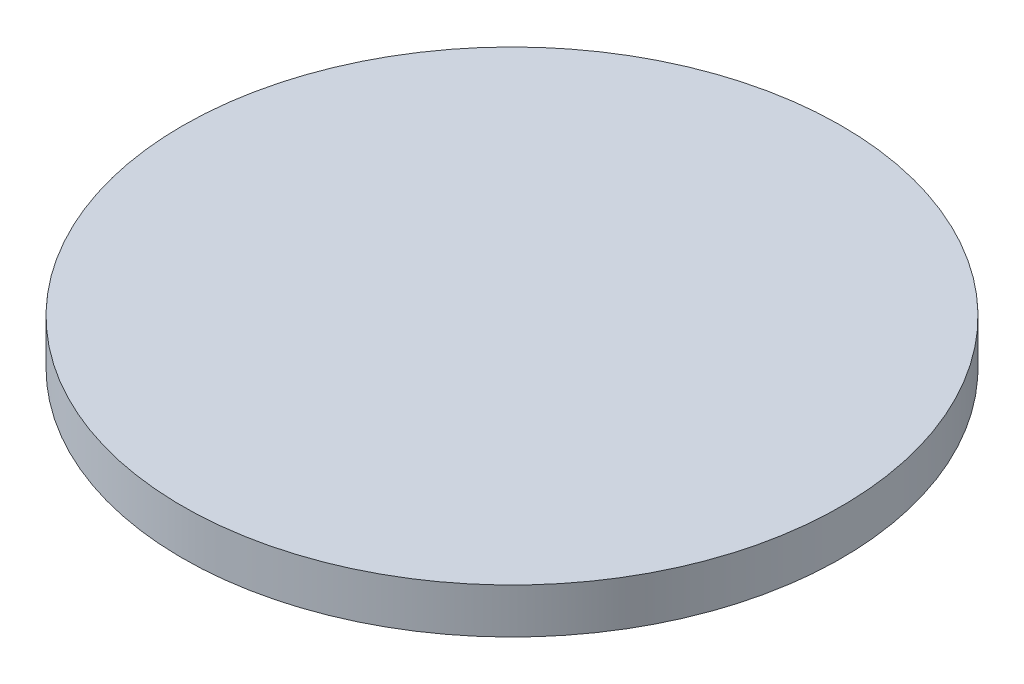
ISO-10303-21;
HEADER;
FILE_DESCRIPTION(('STEP AP214'),'2;1');
FILE_NAME('part.step','',(''),(''),'','','');
FILE_SCHEMA(('AUTOMOTIVE_DESIGN { 1 0 10303 214 1 1 1 1 }'));
ENDSEC;
DATA;
#1=APPLICATION_CONTEXT('core data for automotive mechanical design processes');
#2=APPLICATION_PROTOCOL_DEFINITION('international standard','automotive_design',2000,#1);
#3=PRODUCT_CONTEXT('',#1,'mechanical');
#4=PRODUCT('Part','Part','',(#3));
#5=PRODUCT_RELATED_PRODUCT_CATEGORY('part','',(#4));
#6=PRODUCT_DEFINITION_FORMATION('','',#4);
#7=PRODUCT_DEFINITION_CONTEXT('part definition',#1,'design');
#8=PRODUCT_DEFINITION('design','',#6,#7);
#9=PRODUCT_DEFINITION_SHAPE('','',#8);
#10=(LENGTH_UNIT() NAMED_UNIT(*) SI_UNIT(.MILLI.,.METRE.));
#11=(NAMED_UNIT(*) PLANE_ANGLE_UNIT() SI_UNIT($,.RADIAN.));
#12=(NAMED_UNIT(*) SI_UNIT($,.STERADIAN.) SOLID_ANGLE_UNIT());
#13=UNCERTAINTY_MEASURE_WITH_UNIT(LENGTH_MEASURE(1.E-05),#10,'distance_accuracy_value','');
#14=(GEOMETRIC_REPRESENTATION_CONTEXT(3) GLOBAL_UNCERTAINTY_ASSIGNED_CONTEXT((#13)) GLOBAL_UNIT_ASSIGNED_CONTEXT((#10,
#11,#12)) REPRESENTATION_CONTEXT('',''));
#15=CARTESIAN_POINT('',(0.,0.,0.));
#16=DIRECTION('',(0.,0.,1.));
#17=DIRECTION('',(1.,0.,0.));
#18=AXIS2_PLACEMENT_3D('',#15,#16,#17);
#19=CARTESIAN_POINT('',(-127.302025827772,-45.9930835907232,-0.000163139255021216));
#20=CARTESIAN_POINT('',(-127.302025827772,-45.9930835907232,-2.65855316857933));
#21=CARTESIAN_POINT('',(-127.040829172573,-45.9930835907232,-7.97533322722799));
#22=CARTESIAN_POINT('',(-125.869217424041,-45.9930835907232,-15.8736980675823));
#23=CARTESIAN_POINT('',(-123.929072171381,-45.9930835907232,-23.61919208922));
#24=CARTESIAN_POINT('',(-121.239078073968,-45.9930835907232,-31.1372219505949));
#25=CARTESIAN_POINT('',(-117.825141245459,-45.9930835907232,-38.3553849143689));
#26=CARTESIAN_POINT('',(-113.720139763762,-45.9930835907232,-45.2041661253515));
#27=CARTESIAN_POINT('',(-108.963607037167,-45.9930835907232,-51.6176080765563));
#28=CARTESIAN_POINT('',(-103.601351076016,-45.9930835907232,-57.5339458160494));
#29=CARTESIAN_POINT('',(-97.6850133365234,-45.9930835907232,-62.8962017771999));
#30=CARTESIAN_POINT('',(-91.2715713853185,-45.9930835907232,-67.652734503795));
#31=CARTESIAN_POINT('',(-84.4227901743359,-45.9930835907232,-71.7577359854921));
#32=CARTESIAN_POINT('',(-77.2046272105619,-45.9930835907232,-75.1716728140005));
#33=CARTESIAN_POINT('',(-69.686597349187,-45.9930835907232,-77.8616669114139));
#34=CARTESIAN_POINT('',(-61.9411033275493,-45.9930835907232,-79.8018121640739));
#35=CARTESIAN_POINT('',(-54.042738487195,-45.9930835907232,-80.973423912606));
#36=CARTESIAN_POINT('',(-46.067568399222,-45.9930835907232,-81.3652188954038));
#37=CARTESIAN_POINT('',(-38.092398311249,-45.9930835907232,-80.973423912606));
#38=CARTESIAN_POINT('',(-30.1940334708947,-45.9930835907232,-79.8018121640739));
#39=CARTESIAN_POINT('',(-22.448539449257,-45.9930835907232,-77.8616669114139));
#40=CARTESIAN_POINT('',(-14.9305095878821,-45.9930835907232,-75.1716728140005));
#41=CARTESIAN_POINT('',(-7.71234662410811,-45.9930835907232,-71.7577359854922));
#42=CARTESIAN_POINT('',(-0.863565413125529,-45.9930835907232,-67.652734503795));
#43=CARTESIAN_POINT('',(5.54987653807935,-45.9930835907232,-62.8962017771999));
#44=CARTESIAN_POINT('',(11.4662142775723,-45.9930835907232,-57.5339458160494));
#45=CARTESIAN_POINT('',(16.8284702387229,-45.9930835907232,-51.6176080765564));
#46=CARTESIAN_POINT('',(21.585002965318,-45.9930835907232,-45.2041661253515));
#47=CARTESIAN_POINT('',(25.6900044470151,-45.9930835907232,-38.3553849143689));
#48=CARTESIAN_POINT('',(29.1039412755235,-45.9930835907232,-31.1372219505949));
#49=CARTESIAN_POINT('',(31.7939353729369,-45.9930835907232,-23.61919208922));
#50=CARTESIAN_POINT('',(33.7340806255969,-45.9930835907232,-15.8736980675823));
#51=CARTESIAN_POINT('',(34.905692374129,-45.9930835907232,-7.975333227228));
#52=CARTESIAN_POINT('',(35.2974873569268,-45.9930835907232,-0.000163139254994738));
#53=CARTESIAN_POINT('',(34.905692374129,-45.9930835907232,7.97500694871788));
#54=CARTESIAN_POINT('',(33.7340806255969,-45.9930835907233,15.8733717890723));
#55=CARTESIAN_POINT('',(31.7939353729369,-45.9930835907232,23.6188658107099));
#56=CARTESIAN_POINT('',(29.1039412755235,-45.9930835907232,31.1368956720849));
#57=CARTESIAN_POINT('',(25.6900044470152,-45.9930835907232,38.3550586358588));
#58=CARTESIAN_POINT('',(21.585002965318,-45.9930835907232,45.2038398468415));
#59=CARTESIAN_POINT('',(16.828470238723,-45.9930835907233,51.6172817980463));
#60=CARTESIAN_POINT('',(11.4662142775723,-45.9930835907232,57.5336195375393));
#61=CARTESIAN_POINT('',(5.54987653807935,-45.9930835907232,62.8958754986899));
#62=CARTESIAN_POINT('',(-0.863565413125542,-45.9930835907232,67.652408225285));
#63=CARTESIAN_POINT('',(-7.71234662410805,-45.9930835907232,71.757409706982));
#64=CARTESIAN_POINT('',(-14.9305095878821,-45.9930835907232,75.1713465354905));
#65=CARTESIAN_POINT('',(-22.4485394492569,-45.9930835907232,77.8613406329038));
#66=CARTESIAN_POINT('',(-30.1940334708947,-45.9930835907232,79.8014858855638));
#67=CARTESIAN_POINT('',(-38.092398311249,-45.9930835907232,80.9730976340959));
#68=CARTESIAN_POINT('',(-46.0675683992219,-45.9930835907232,81.3648926168938));
#69=CARTESIAN_POINT('',(-54.042738487195,-45.9930835907232,80.9730976340959));
#70=CARTESIAN_POINT('',(-61.9411033275493,-45.9930835907233,79.8014858855639));
#71=CARTESIAN_POINT('',(-69.686597349187,-45.9930835907232,77.8613406329038));
#72=CARTESIAN_POINT('',(-77.2046272105619,-45.9930835907232,75.1713465354905));
#73=CARTESIAN_POINT('',(-84.4227901743359,-45.9930835907232,71.7574097069821));
#74=CARTESIAN_POINT('',(-91.2715713853184,-45.9930835907232,67.652408225285));
#75=CARTESIAN_POINT('',(-97.6850133365233,-45.9930835907232,62.8958754986899));
#76=CARTESIAN_POINT('',(-103.601351076016,-45.9930835907233,57.5336195375394));
#77=CARTESIAN_POINT('',(-108.963607037167,-45.9930835907232,51.6172817980463));
#78=CARTESIAN_POINT('',(-113.720139763762,-45.9930835907232,45.2038398468415));
#79=CARTESIAN_POINT('',(-117.825141245459,-45.9930835907232,38.3550586358588));
#80=CARTESIAN_POINT('',(-121.239078073967,-45.9930835907232,31.136895672085));
#81=CARTESIAN_POINT('',(-123.929072171381,-45.9930835907232,23.61886581071));
#82=CARTESIAN_POINT('',(-125.869217424041,-45.9930835907232,15.8733717890723));
#83=CARTESIAN_POINT('',(-127.040829172573,-45.9930835907232,7.97500694871791));
#84=CARTESIAN_POINT('',(-127.302025827772,-45.9930835907232,2.6582268900693));
#85=CARTESIAN_POINT('',(-127.302025827772,-45.9930835907232,-0.000163139255021216));
#86=B_SPLINE_CURVE_WITH_KNOTS('',3,(#19,#20,#21,#22,#23,#24,#25,#26,#27,#28,#29,#30,#31,#32,#33,
#34,#35,#36,#37,#38,#39,#40,#41,#42,#43,#44,#45,#46,#47,#48,#49,#50,#51,#52,#53,#54,#55,#56,#57,
#58,#59,#60,#61,#62,#63,#64,#65,#66,#67,#68,#69,#70,#71,#72,#73,#74,#75,#76,#77,#78,#79,#80,#81,
#82,#83,#84,#85),.UNSPECIFIED.,.T.,.F.,(4,1,1,1,1,1,1,1,1,1,1,1,1,1,1,1,1,1,1,1,1,1,1,1,1,1,1,1,
1,1,1,1,1,1,1,1,1,1,1,1,1,1,1,1,1,1,1,1,1,1,1,1,1,1,1,1,1,1,1,1,1,1,1,1,4),(0.,0.015625,0.03125,
0.046875,0.0625,0.078125,0.09375,0.109375,0.125,0.140625,0.15625,0.171875,0.1875,0.203125,
0.21875,0.234375,0.25,0.265625,0.28125,0.296875,0.3125,0.328125,0.34375,0.359375,0.375,0.390625,
0.40625,0.421875,0.4375,0.453125,0.46875,0.484375,0.5,0.515625,0.53125,0.546875,0.5625,0.578125,
0.59375,0.609375,0.625,0.640625,0.65625,0.671875,0.6875,0.703125,0.71875,0.734375,0.75,0.765625,
0.78125,0.796875,0.8125,0.828125,0.84375,0.859375,0.875,0.890625,0.90625,0.921875,0.9375,
0.953125,0.96875,0.984375,1.),.UNSPECIFIED.);
#87=DIRECTION('',(0.,1.,0.));
#88=VECTOR('',#87,1.);
#89=SURFACE_OF_LINEAR_EXTRUSION('',#86,#88);
#90=CARTESIAN_POINT('',(-127.302025827772,-45.9930835907232,-0.000163139255021216));
#91=CARTESIAN_POINT('',(-127.302025827771,-45.9930835907232,1.32903187540712));
#92=CARTESIAN_POINT('',(-127.269376245872,-45.9930835907232,2.65822689006927));
#93=CARTESIAN_POINT('',(-127.138935134933,-45.9930835907232,5.3134167007428));
#94=CARTESIAN_POINT('',(-127.041143605895,-45.9930835907232,6.63941149675417));
#95=CARTESIAN_POINT('',(-126.78057581734,-45.9930835907232,9.28500065147537));
#96=CARTESIAN_POINT('',(-126.617799557823,-45.9930835907232,10.6045950101852));
#97=CARTESIAN_POINT('',(-126.227732444213,-45.9930835907232,13.2342138915076));
#98=CARTESIAN_POINT('',(-126.000441590119,-45.9930835907232,14.5442384141201));
#99=CARTESIAN_POINT('',(-125.481815423254,-45.9930835907232,17.1515482244521));
#100=CARTESIAN_POINT('',(-125.190480110482,-45.9930835907232,18.4488335121716));
#101=CARTESIAN_POINT('',(-124.544543553736,-45.9930835907232,21.0275567968197));
#102=CARTESIAN_POINT('',(-124.189942309761,-45.9930835907232,22.3089947937484));
#103=CARTESIAN_POINT('',(-123.418252418083,-45.9930835907232,24.8529154409171));
#104=CARTESIAN_POINT('',(-123.001163770378,-45.9930835907232,26.1153980911572));
#105=CARTESIAN_POINT('',(-122.105578492643,-45.9930835907232,28.6183912642265));
#106=CARTESIAN_POINT('',(-121.627081862612,-45.9930835907232,29.8589017870556));
#107=CARTESIAN_POINT('',(-120.609760041625,-45.9930835907232,32.3149339245804));
#108=CARTESIAN_POINT('',(-120.070934850669,-45.9930835907232,33.5304555392761));
#109=CARTESIAN_POINT('',(-118.934325827746,-45.9930835907232,35.9336134082345));
#110=CARTESIAN_POINT('',(-118.336541995778,-45.9930835907232,37.1212496624972));
#111=CARTESIAN_POINT('',(-117.083385610744,-45.9930835907232,39.4657403582899));
#112=CARTESIAN_POINT('',(-116.428013057677,-45.9930835907232,40.62259479982));
#113=CARTESIAN_POINT('',(-115.06132645579,-45.9930835907232,42.9027736406898));
#114=CARTESIAN_POINT('',(-114.35001240697,-45.9930835907232,44.0260980400295));
#115=CARTESIAN_POINT('',(-112.873090038921,-45.9930835907232,46.2364685670607));
#116=CARTESIAN_POINT('',(-112.107481719693,-45.9930835907232,47.3235146947523));
#117=CARTESIAN_POINT('',(-110.523879477926,-45.9930835907232,49.4587551388233));
#118=CARTESIAN_POINT('',(-109.705885555387,-45.9930835907232,50.5069494552028));
#119=CARTESIAN_POINT('',(-108.019420774096,-45.9930835907232,52.5619127369858));
#120=CARTESIAN_POINT('',(-107.150949915344,-45.9930835907232,53.5686817023893));
#121=CARTESIAN_POINT('',(-105.365682988969,-45.9930835907232,55.538420216944));
#122=CARTESIAN_POINT('',(-104.448886921346,-45.9930835907232,56.5013897660953));
#123=CARTESIAN_POINT('',(-102.569121304572,-45.9930835907232,58.3811553828692));
#124=CARTESIAN_POINT('',(-101.606151755421,-45.9930835907232,59.2979514504919));
#125=CARTESIAN_POINT('',(-99.6364132408663,-45.9930835907232,61.0832183768665));
#126=CARTESIAN_POINT('',(-98.6296442754629,-45.9930835907232,61.9516892356185));
#127=CARTESIAN_POINT('',(-96.5746809936799,-45.9930835907232,63.6381540169094));
#128=CARTESIAN_POINT('',(-95.5264866773004,-45.9930835907232,64.4561479394484));
#129=CARTESIAN_POINT('',(-93.3912462332294,-45.9930835907232,66.0397501812158));
#130=CARTESIAN_POINT('',(-92.3042001055378,-45.9930835907232,66.8053585004443));
#131=CARTESIAN_POINT('',(-90.0938295785066,-45.9930835907232,68.282280868493));
#132=CARTESIAN_POINT('',(-88.9705051791669,-45.9930835907232,68.9935949173133));
#133=CARTESIAN_POINT('',(-86.6903263382972,-45.9930835907232,70.3602815192002));
#134=CARTESIAN_POINT('',(-85.5334718967671,-45.9930835907232,71.0156540722668));
#135=CARTESIAN_POINT('',(-83.1889812009743,-45.9930835907232,72.2688104573011));
#136=CARTESIAN_POINT('',(-82.0013449467116,-45.9930835907232,72.8665942892686));
#137=CARTESIAN_POINT('',(-79.5981870777532,-45.9930835907232,74.003203312192));
#138=CARTESIAN_POINT('',(-78.3826654630575,-45.9930835907232,74.5420285031478));
#139=CARTESIAN_POINT('',(-75.9266333255327,-45.9930835907232,75.5593503241348));
#140=CARTESIAN_POINT('',(-74.6861228027036,-45.9930835907232,76.037846954166));
#141=CARTESIAN_POINT('',(-72.1831296296344,-45.9930835907232,76.9334322319013));
#142=CARTESIAN_POINT('',(-70.9206469793943,-45.9930835907232,77.3505208796055));
#143=CARTESIAN_POINT('',(-68.3767263322255,-45.9930835907232,78.1222107712844));
#144=CARTESIAN_POINT('',(-67.0952883352968,-45.9930835907232,78.4768120152591));
#145=CARTESIAN_POINT('',(-64.5165650506487,-45.9930835907232,79.1227485720052));
#146=CARTESIAN_POINT('',(-63.2192797629292,-45.9930835907232,79.4140838847765));
#147=CARTESIAN_POINT('',(-60.6119699525972,-45.9930835907232,79.9327100516419));
#148=CARTESIAN_POINT('',(-59.3019454299847,-45.9930835907232,80.1600009057359));
#149=CARTESIAN_POINT('',(-56.6723265486623,-45.9930835907232,80.5500680193463));
#150=CARTESIAN_POINT('',(-55.3527321899525,-45.9930835907232,80.7128442788627));
#151=CARTESIAN_POINT('',(-52.7071430352312,-45.9930835907232,80.9734120674177));
#152=CARTESIAN_POINT('',(-51.3811482392199,-45.9930835907232,81.0712035964563));
#153=CARTESIAN_POINT('',(-48.7259584285463,-45.9930835907232,81.2016447073946));
#154=CARTESIAN_POINT('',(-47.3967634138842,-45.9930835907232,81.2342942892945));
#155=CARTESIAN_POINT('',(-44.7383733845598,-45.9930835907232,81.2342942892945));
#156=CARTESIAN_POINT('',(-43.4091783698977,-45.9930835907232,81.2016447073947));
#157=CARTESIAN_POINT('',(-40.7539885592241,-45.9930835907232,81.0712035964563));
#158=CARTESIAN_POINT('',(-39.4279937632128,-45.9930835907232,80.9734120674177));
#159=CARTESIAN_POINT('',(-36.7824046084916,-45.9930835907232,80.7128442788627));
#160=CARTESIAN_POINT('',(-35.4628102497817,-45.9930835907232,80.5500680193463));
#161=CARTESIAN_POINT('',(-32.8331913684594,-45.9930835907232,80.1600009057359));
#162=CARTESIAN_POINT('',(-31.5231668458468,-45.9930835907232,79.9327100516419));
#163=CARTESIAN_POINT('',(-28.9158570355148,-45.9930835907232,79.4140838847765));
#164=CARTESIAN_POINT('',(-27.6185717477953,-45.9930835907232,79.1227485720052));
#165=CARTESIAN_POINT('',(-25.0398484631472,-45.9930835907232,78.4768120152591));
#166=CARTESIAN_POINT('',(-23.7584104662185,-45.9930835907232,78.1222107712844));
#167=CARTESIAN_POINT('',(-21.2144898190497,-45.9930835907232,77.3505208796055));
#168=CARTESIAN_POINT('',(-19.9520071688096,-45.9930835907232,76.9334322319013));
#169=CARTESIAN_POINT('',(-17.4490139957404,-45.9930835907232,76.037846954166));
#170=CARTESIAN_POINT('',(-16.2085034729113,-45.9930835907232,75.5593503241348));
#171=CARTESIAN_POINT('',(-13.7524713353865,-45.9930835907232,74.5420285031478));
#172=CARTESIAN_POINT('',(-12.5369497206908,-45.9930835907232,74.0032033121921));
#173=CARTESIAN_POINT('',(-10.1337918517324,-45.9930835907232,72.8665942892687));
#174=CARTESIAN_POINT('',(-8.94615559746971,-45.9930835907232,72.2688104573011));
#175=CARTESIAN_POINT('',(-6.60166490167694,-45.9930835907232,71.0156540722668));
#176=CARTESIAN_POINT('',(-5.44481046014687,-45.9930835907232,70.3602815192002));
#177=CARTESIAN_POINT('',(-3.16463161927711,-45.9930835907232,68.9935949173132));
#178=CARTESIAN_POINT('',(-2.04130721993742,-45.9930835907232,68.282280868493));
#179=CARTESIAN_POINT('',(0.169063307093821,-45.9930835907232,66.8053585004443));
#180=CARTESIAN_POINT('',(1.25610943478537,-45.9930835907232,66.0397501812159));
#181=CARTESIAN_POINT('',(3.39134987885641,-45.9930835907232,64.4561479394484));
#182=CARTESIAN_POINT('',(4.43954419523589,-45.9930835907232,63.6381540169094));
#183=CARTESIAN_POINT('',(6.49450747701886,-45.9930835907232,61.9516892356185));
#184=CARTESIAN_POINT('',(7.50127644242236,-45.9930835907232,61.0832183768665));
#185=CARTESIAN_POINT('',(9.47101495697708,-45.9930835907232,59.2979514504919));
#186=CARTESIAN_POINT('',(10.4339845061283,-45.9930835907232,58.3811553828692));
#187=CARTESIAN_POINT('',(12.3137501229022,-45.9930835907232,56.5013897660953));
#188=CARTESIAN_POINT('',(13.2305461905249,-45.9930835907232,55.538420216944));
#189=CARTESIAN_POINT('',(15.0158131168996,-45.9930835907232,53.5686817023893));
#190=CARTESIAN_POINT('',(15.8842839756515,-45.9930835907232,52.5619127369858));
#191=CARTESIAN_POINT('',(17.5707487569425,-45.9930835907232,50.5069494552028));
#192=CARTESIAN_POINT('',(18.3887426794815,-45.9930835907232,49.4587551388234));
#193=CARTESIAN_POINT('',(19.9723449212489,-45.9930835907232,47.3235146947524));
#194=CARTESIAN_POINT('',(20.7379532404773,-45.9930835907232,46.2364685670608));
#195=CARTESIAN_POINT('',(22.214875608526,-45.9930835907232,44.0260980400296));
#196=CARTESIAN_POINT('',(22.9261896573463,-45.9930835907232,42.9027736406899));
#197=CARTESIAN_POINT('',(24.2928762592332,-45.9930835907232,40.6225947998201));
#198=CARTESIAN_POINT('',(24.9482488122999,-45.9930835907232,39.46574035829));
#199=CARTESIAN_POINT('',(26.2014051973341,-45.9930835907232,37.1212496624973));
#200=CARTESIAN_POINT('',(26.7991890293017,-45.9930835907232,35.9336134082346));
#201=CARTESIAN_POINT('',(27.9357980522251,-45.9930835907232,33.5304555392762));
#202=CARTESIAN_POINT('',(28.4746232431809,-45.9930835907232,32.3149339245805));
#203=CARTESIAN_POINT('',(29.4919450641678,-45.9930835907232,29.8589017870557));
#204=CARTESIAN_POINT('',(29.970441694199,-45.9930835907232,28.6183912642266));
#205=CARTESIAN_POINT('',(30.8660269719344,-45.9930835907232,26.1153980911574));
#206=CARTESIAN_POINT('',(31.2831156196385,-45.9930835907232,24.8529154409173));
#207=CARTESIAN_POINT('',(32.0548055113174,-45.9930835907232,22.3089947937485));
#208=CARTESIAN_POINT('',(32.4094067552921,-45.9930835907232,21.0275567968198));
#209=CARTESIAN_POINT('',(33.0553433120382,-45.9930835907232,18.4488335121717));
#210=CARTESIAN_POINT('',(33.3466786248095,-45.9930835907233,17.1515482244522));
#211=CARTESIAN_POINT('',(33.8653047916749,-45.9930835907233,14.5442384141202));
#212=CARTESIAN_POINT('',(34.0925956457689,-45.9930835907232,13.2342138915077));
#213=CARTESIAN_POINT('',(34.4826627593793,-45.9930835907232,10.6045950101853));
#214=CARTESIAN_POINT('',(34.6454390188957,-45.9930835907232,9.28500065147549));
#215=CARTESIAN_POINT('',(34.9060068074507,-45.9930835907232,6.63941149675428));
#216=CARTESIAN_POINT('',(35.0037983364893,-45.9930835907232,5.3134167007429));
#217=CARTESIAN_POINT('',(35.1342394474277,-45.9930835907232,2.65822689006938));
#218=CARTESIAN_POINT('',(35.1668890293275,-45.9930835907232,1.32903187540723));
#219=CARTESIAN_POINT('',(35.1668890293275,-45.9930835907232,-1.32935815391708));
#220=CARTESIAN_POINT('',(35.1342394474277,-45.9930835907233,-2.65855316857924));
#221=CARTESIAN_POINT('',(35.0037983364893,-45.9930835907233,-5.31374297925278));
#222=CARTESIAN_POINT('',(34.9060068074508,-45.9930835907233,-6.63973777526417));
#223=CARTESIAN_POINT('',(34.6454390188958,-45.9930835907232,-9.28532692998539));
#224=CARTESIAN_POINT('',(34.4826627593794,-45.9930835907232,-10.6049212886952));
#225=CARTESIAN_POINT('',(34.0925956457689,-45.9930835907232,-13.2345401700176));
#226=CARTESIAN_POINT('',(33.8653047916749,-45.9930835907232,-14.5445646926301));
#227=CARTESIAN_POINT('',(33.3466786248096,-45.9930835907232,-17.1518745029621));
#228=CARTESIAN_POINT('',(33.0553433120382,-45.9930835907232,-18.4491597906816));
#229=CARTESIAN_POINT('',(32.4094067552922,-45.9930835907232,-21.0278830753298));
#230=CARTESIAN_POINT('',(32.0548055113175,-45.9930835907232,-22.3093210722584));
#231=CARTESIAN_POINT('',(31.2831156196386,-45.9930835907232,-24.8532417194272));
#232=CARTESIAN_POINT('',(30.8660269719344,-45.9930835907232,-26.1157243696673));
#233=CARTESIAN_POINT('',(29.970441694199,-45.9930835907232,-28.6187175427365));
#234=CARTESIAN_POINT('',(29.4919450641678,-45.9930835907232,-29.8592280655656));
#235=CARTESIAN_POINT('',(28.4746232431809,-45.9930835907232,-32.3152602030904));
#236=CARTESIAN_POINT('',(27.9357980522251,-45.9930835907232,-33.5307818177862));
#237=CARTESIAN_POINT('',(26.7991890293017,-45.9930835907232,-35.9339396867446));
#238=CARTESIAN_POINT('',(26.2014051973341,-45.9930835907232,-37.1215759410072));
#239=CARTESIAN_POINT('',(24.9482488122999,-45.9930835907232,-39.4660666368));
#240=CARTESIAN_POINT('',(24.2928762592332,-45.9930835907232,-40.6229210783301));
#241=CARTESIAN_POINT('',(22.9261896573463,-45.9930835907232,-42.9030999191999));
#242=CARTESIAN_POINT('',(22.2148756085261,-45.9930835907232,-44.0264243185396));
#243=CARTESIAN_POINT('',(20.7379532404773,-45.9930835907232,-46.2367948455708));
#244=CARTESIAN_POINT('',(19.9723449212489,-45.9930835907232,-47.3238409732624));
#245=CARTESIAN_POINT('',(18.3887426794815,-45.9930835907232,-49.4590814173334));
#246=CARTESIAN_POINT('',(17.5707487569425,-45.9930835907232,-50.5072757337129));
#247=CARTESIAN_POINT('',(15.8842839756516,-45.9930835907232,-52.5622390154958));
#248=CARTESIAN_POINT('',(15.0158131168996,-45.9930835907232,-53.5690079808993));
#249=CARTESIAN_POINT('',(13.230546190525,-45.9930835907232,-55.5387464954541));
#250=CARTESIAN_POINT('',(12.3137501229023,-45.9930835907232,-56.5017160446053));
#251=CARTESIAN_POINT('',(10.4339845061283,-45.9930835907232,-58.3814816613792));
#252=CARTESIAN_POINT('',(9.47101495697711,-45.9930835907232,-59.2982777290019));
#253=CARTESIAN_POINT('',(7.5012764424224,-45.9930835907232,-61.0835446553766));
#254=CARTESIAN_POINT('',(6.4945074770189,-45.9930835907232,-61.9520155141285));
#255=CARTESIAN_POINT('',(4.43954419523593,-45.9930835907232,-63.6384802954194));
#256=CARTESIAN_POINT('',(3.39134987885645,-45.9930835907232,-64.4564742179584));
#257=CARTESIAN_POINT('',(1.25610943478542,-45.9930835907232,-66.0400764597259));
#258=CARTESIAN_POINT('',(0.16906330709387,-45.9930835907232,-66.8056847789543));
#259=CARTESIAN_POINT('',(-2.04130721993737,-45.9930835907232,-68.282607147003));
#260=CARTESIAN_POINT('',(-3.16463161927707,-45.9930835907232,-68.9939211958233));
#261=CARTESIAN_POINT('',(-5.44481046014683,-45.9930835907232,-70.3606077977102));
#262=CARTESIAN_POINT('',(-6.6016649016769,-45.9930835907232,-71.0159803507769));
#263=CARTESIAN_POINT('',(-8.94615559746967,-45.9930835907232,-72.2691367358111));
#264=CARTESIAN_POINT('',(-10.1337918517324,-45.9930835907232,-72.8669205677787));
#265=CARTESIAN_POINT('',(-12.5369497206907,-45.9930835907232,-74.0035295907021));
#266=CARTESIAN_POINT('',(-13.7524713353865,-45.9930835907232,-74.5423547816579));
#267=CARTESIAN_POINT('',(-16.2085034729113,-45.9930835907232,-75.5596766026448));
#268=CARTESIAN_POINT('',(-17.4490139957404,-45.9930835907232,-76.038173232676));
#269=CARTESIAN_POINT('',(-19.9520071688096,-45.9930835907232,-76.9337585104113));
#270=CARTESIAN_POINT('',(-21.2144898190497,-45.9930835907232,-77.3508471581155));
#271=CARTESIAN_POINT('',(-23.7584104662185,-45.9930835907232,-78.1225370497944));
#272=CARTESIAN_POINT('',(-25.0398484631472,-45.9930835907232,-78.4771382937691));
#273=CARTESIAN_POINT('',(-27.6185717477953,-45.9930835907232,-79.1230748505152));
#274=CARTESIAN_POINT('',(-28.9158570355148,-45.9930835907232,-79.4144101632865));
#275=CARTESIAN_POINT('',(-31.5231668458468,-45.9930835907232,-79.9330363301519));
#276=CARTESIAN_POINT('',(-32.8331913684593,-45.9930835907232,-80.1603271842459));
#277=CARTESIAN_POINT('',(-35.4628102497817,-45.9930835907232,-80.5503942978563));
#278=CARTESIAN_POINT('',(-36.7824046084915,-45.9930835907232,-80.7131705573728));
#279=CARTESIAN_POINT('',(-39.4279937632127,-45.9930835907232,-80.9737383459278));
#280=CARTESIAN_POINT('',(-40.7539885592241,-45.9930835907232,-81.0715298749663));
#281=CARTESIAN_POINT('',(-43.4091783698977,-45.9930835907232,-81.2019709859047));
#282=CARTESIAN_POINT('',(-44.7383733845598,-45.9930835907232,-81.2346205678045));
#283=CARTESIAN_POINT('',(-47.3967634138841,-45.9930835907232,-81.2346205678045));
#284=CARTESIAN_POINT('',(-48.7259584285463,-45.9930835907232,-81.2019709859047));
#285=CARTESIAN_POINT('',(-51.3811482392198,-45.9930835907232,-81.0715298749663));
#286=CARTESIAN_POINT('',(-52.7071430352312,-45.9930835907232,-80.9737383459278));
#287=CARTESIAN_POINT('',(-55.3527321899524,-45.9930835907232,-80.7131705573728));
#288=CARTESIAN_POINT('',(-56.6723265486623,-45.9930835907232,-80.5503942978564));
#289=CARTESIAN_POINT('',(-59.3019454299846,-45.9930835907232,-80.1603271842459));
#290=CARTESIAN_POINT('',(-60.6119699525972,-45.9930835907232,-79.9330363301519));
#291=CARTESIAN_POINT('',(-63.2192797629292,-45.9930835907232,-79.4144101632866));
#292=CARTESIAN_POINT('',(-64.5165650506487,-45.9930835907232,-79.1230748505152));
#293=CARTESIAN_POINT('',(-67.0952883352968,-45.9930835907232,-78.4771382937691));
#294=CARTESIAN_POINT('',(-68.3767263322255,-45.9930835907232,-78.1225370497944));
#295=CARTESIAN_POINT('',(-70.9206469793942,-45.9930835907232,-77.3508471581155));
#296=CARTESIAN_POINT('',(-72.1831296296343,-45.9930835907232,-76.9337585104114));
#297=CARTESIAN_POINT('',(-74.6861228027036,-45.9930835907232,-76.038173232676));
#298=CARTESIAN_POINT('',(-75.9266333255327,-45.9930835907232,-75.5596766026448));
#299=CARTESIAN_POINT('',(-78.3826654630575,-45.9930835907232,-74.5423547816579));
#300=CARTESIAN_POINT('',(-79.5981870777532,-45.9930835907232,-74.0035295907021));
#301=CARTESIAN_POINT('',(-82.0013449467116,-45.9930835907232,-72.8669205677788));
#302=CARTESIAN_POINT('',(-83.1889812009742,-45.9930835907232,-72.2691367358111));
#303=CARTESIAN_POINT('',(-85.533471896767,-45.9930835907232,-71.0159803507769));
#304=CARTESIAN_POINT('',(-86.6903263382971,-45.9930835907232,-70.3606077977102));
#305=CARTESIAN_POINT('',(-88.9705051791668,-45.9930835907232,-68.9939211958233));
#306=CARTESIAN_POINT('',(-90.0938295785065,-45.9930835907232,-68.282607147003));
#307=CARTESIAN_POINT('',(-92.3042001055378,-45.9930835907232,-66.8056847789543));
#308=CARTESIAN_POINT('',(-93.3912462332294,-45.9930835907232,-66.0400764597259));
#309=CARTESIAN_POINT('',(-95.5264866773004,-45.9930835907232,-64.4564742179585));
#310=CARTESIAN_POINT('',(-96.5746809936799,-45.9930835907232,-63.6384802954195));
#311=CARTESIAN_POINT('',(-98.6296442754629,-45.9930835907232,-61.9520155141285));
#312=CARTESIAN_POINT('',(-99.6364132408663,-45.9930835907232,-61.0835446553766));
#313=CARTESIAN_POINT('',(-101.606151755421,-45.9930835907232,-59.298277729002));
#314=CARTESIAN_POINT('',(-102.569121304572,-45.9930835907232,-58.3814816613792));
#315=CARTESIAN_POINT('',(-104.448886921346,-45.9930835907232,-56.5017160446053));
#316=CARTESIAN_POINT('',(-105.365682988969,-45.9930835907232,-55.5387464954541));
#317=CARTESIAN_POINT('',(-107.150949915344,-45.9930835907232,-53.5690079808994));
#318=CARTESIAN_POINT('',(-108.019420774096,-45.9930835907232,-52.5622390154959));
#319=CARTESIAN_POINT('',(-109.705885555387,-45.9930835907232,-50.5072757337129));
#320=CARTESIAN_POINT('',(-110.523879477925,-45.9930835907232,-49.4590814173334));
#321=CARTESIAN_POINT('',(-112.107481719693,-45.9930835907232,-47.3238409732624));
#322=CARTESIAN_POINT('',(-112.873090038921,-45.9930835907232,-46.2367948455709));
#323=CARTESIAN_POINT('',(-114.35001240697,-45.9930835907232,-44.0264243185396));
#324=CARTESIAN_POINT('',(-115.06132645579,-45.9930835907232,-42.9030999191999));
#325=CARTESIAN_POINT('',(-116.428013057677,-45.9930835907232,-40.6229210783301));
#326=CARTESIAN_POINT('',(-117.083385610744,-45.9930835907232,-39.4660666368001));
#327=CARTESIAN_POINT('',(-118.336541995778,-45.9930835907232,-37.1215759410073));
#328=CARTESIAN_POINT('',(-118.934325827746,-45.9930835907232,-35.9339396867446));
#329=CARTESIAN_POINT('',(-120.070934850669,-45.9930835907232,-33.5307818177862));
#330=CARTESIAN_POINT('',(-120.609760041625,-45.9930835907232,-32.3152602030905));
#331=CARTESIAN_POINT('',(-121.627081862612,-45.9930835907232,-29.8592280655657));
#332=CARTESIAN_POINT('',(-122.105578492643,-45.9930835907232,-28.6187175427366));
#333=CARTESIAN_POINT('',(-123.001163770378,-45.9930835907232,-26.1157243696674));
#334=CARTESIAN_POINT('',(-123.418252418083,-45.9930835907232,-24.8532417194273));
#335=CARTESIAN_POINT('',(-124.189942309761,-45.9930835907232,-22.3093210722585));
#336=CARTESIAN_POINT('',(-124.544543553736,-45.9930835907232,-21.0278830753298));
#337=CARTESIAN_POINT('',(-125.190480110482,-45.9930835907232,-18.4491597906817));
#338=CARTESIAN_POINT('',(-125.481815423254,-45.9930835907232,-17.1518745029622));
#339=CARTESIAN_POINT('',(-126.000441590119,-45.9930835907232,-14.5445646926302));
#340=CARTESIAN_POINT('',(-126.227732444213,-45.9930835907232,-13.2345401700177));
#341=CARTESIAN_POINT('',(-126.617799557823,-45.9930835907232,-10.6049212886953));
#342=CARTESIAN_POINT('',(-126.78057581734,-45.9930835907232,-9.28532692998548));
#343=CARTESIAN_POINT('',(-127.041143605895,-45.9930835907232,-6.63973777526427));
#344=CARTESIAN_POINT('',(-127.138935134933,-45.9930835907232,-5.31374297925288));
#345=CARTESIAN_POINT('',(-127.269376245872,-45.9930835907232,-2.65855316857934));
#346=CARTESIAN_POINT('',(-127.302025827772,-45.9930835907232,-1.32935815391718));
#347=CARTESIAN_POINT('',(-127.302025827772,-45.9930835907232,-0.000163139255021216));
#348=B_SPLINE_CURVE_WITH_KNOTS('',3,(#90,#91,#92,#93,#94,#95,#96,#97,#98,#99,#100,#101,#102,
#103,#104,#105,#106,#107,#108,#109,#110,#111,#112,#113,#114,#115,#116,#117,#118,#119,#120,#121,
#122,#123,#124,#125,#126,#127,#128,#129,#130,#131,#132,#133,#134,#135,#136,#137,#138,#139,#140,
#141,#142,#143,#144,#145,#146,#147,#148,#149,#150,#151,#152,#153,#154,#155,#156,#157,#158,#159,
#160,#161,#162,#163,#164,#165,#166,#167,#168,#169,#170,#171,#172,#173,#174,#175,#176,#177,#178,
#179,#180,#181,#182,#183,#184,#185,#186,#187,#188,#189,#190,#191,#192,#193,#194,#195,#196,#197,
#198,#199,#200,#201,#202,#203,#204,#205,#206,#207,#208,#209,#210,#211,#212,#213,#214,#215,#216,
#217,#218,#219,#220,#221,#222,#223,#224,#225,#226,#227,#228,#229,#230,#231,#232,#233,#234,#235,
#236,#237,#238,#239,#240,#241,#242,#243,#244,#245,#246,#247,#248,#249,#250,#251,#252,#253,#254,
#255,#256,#257,#258,#259,#260,#261,#262,#263,#264,#265,#266,#267,#268,#269,#270,#271,#272,#273,
#274,#275,#276,#277,#278,#279,#280,#281,#282,#283,#284,#285,#286,#287,#288,#289,#290,#291,#292,
#293,#294,#295,#296,#297,#298,#299,#300,#301,#302,#303,#304,#305,#306,#307,#308,#309,#310,#311,
#312,#313,#314,#315,#316,#317,#318,#319,#320,#321,#322,#323,#324,#325,#326,#327,#328,#329,#330,
#331,#332,#333,#334,#335,#336,#337,#338,#339,#340,#341,#342,#343,#344,#345,#346,#347),
.UNSPECIFIED.,.F.,.F.,(4,2,2,2,2,2,2,2,2,2,2,2,2,2,2,2,2,2,2,2,2,2,2,2,2,2,2,2,2,2,2,2,2,2,2,2,
2,2,2,2,2,2,2,2,2,2,2,2,2,2,2,2,2,2,2,2,2,2,2,2,2,2,2,2,2,2,2,2,2,2,2,2,2,2,2,2,2,2,2,2,2,2,2,2,
2,2,2,2,2,2,2,2,2,2,2,2,2,2,2,2,2,2,2,2,2,2,2,2,2,2,2,2,2,2,2,2,2,2,2,2,2,2,2,2,2,2,2,2,4),(0.,
3.9871862839769,7.9743725679538,11.9615588519307,15.9487451359077,19.9359314198846,
23.9231177038615,27.9103039878385,31.8974902718154,35.8846765557923,39.8718628397693,
43.8590491237462,47.8462354077232,51.8334216917001,55.820607975677,59.807794259654,
63.7949805436309,67.7821668276079,71.7693531115848,75.7565393955617,79.7437256795387,
83.7309119635156,87.7180982474925,91.7052845314695,95.6924708154465,99.6796570994234,
103.6668433834,107.654029667377,111.641215951354,115.628402235331,119.615588519308,
123.602774803285,127.589961087262,131.577147371239,135.564333655216,139.551519939193,
143.53870622317,147.525892507147,151.513078791124,155.5002650751,159.487451359077,
163.474637643054,167.461823927031,171.449010211008,175.436196494985,179.423382778962,
183.410569062939,187.397755346916,191.384941630893,195.37212791487,199.359314198847,
203.346500482824,207.333686766801,211.320873050778,215.308059334755,219.295245618731,
223.282431902708,227.269618186685,231.256804470662,235.243990754639,239.231177038616,
243.218363322593,247.20554960657,251.192735890547,255.179922174524,259.167108458501,
263.154294742478,267.141481026455,271.128667310432,275.115853594408,279.103039878385,
283.090226162362,287.077412446339,291.064598730316,295.051785014293,299.03897129827,
303.026157582247,307.013343866224,311.000530150201,314.987716434178,318.974902718155,
322.962089002132,326.949275286109,330.936461570085,334.923647854062,338.910834138039,
342.898020422016,346.885206705993,350.87239298997,354.859579273947,358.846765557924,
362.833951841901,366.821138125878,370.808324409855,374.795510693832,378.782696977809,
382.769883261786,386.757069545762,390.744255829739,394.731442113716,398.718628397693,
402.70581468167,406.693000965647,410.680187249624,414.667373533601,418.654559817578,
422.641746101555,426.628932385532,430.616118669509,434.603304953486,438.590491237463,
442.57767752144,446.564863805417,450.552050089393,454.53923637337,458.526422657347,
462.513608941324,466.500795225301,470.487981509278,474.475167793255,478.462354077232,
482.449540361209,486.436726645186,490.423912929163,494.41109921314,498.398285497117,
502.385471781093,506.37265806507,510.359844349047),.UNSPECIFIED.);
#349=CARTESIAN_POINT('',(-127.302025827772,-45.9930835907232,-0.000163139255021216));
#350=VERTEX_POINT('',#349);
#351=EDGE_CURVE('E9',#350,#350,#348,.F.);
#352=ORIENTED_EDGE('',*,*,#351,.F.);
#353=EDGE_LOOP('',(#352));
#354=FACE_BOUND('',#353,.T.);
#355=CARTESIAN_POINT('',(-127.302025827772,-34.8861915862064,-0.000163139255021216));
#356=CARTESIAN_POINT('',(-127.302025827772,-34.8861915862064,-2.65855316857933));
#357=CARTESIAN_POINT('',(-127.040829172573,-34.8861915862064,-7.97533322722799));
#358=CARTESIAN_POINT('',(-125.869217424041,-34.8861915862064,-15.8736980675823));
#359=CARTESIAN_POINT('',(-123.929072171381,-34.8861915862064,-23.61919208922));
#360=CARTESIAN_POINT('',(-121.239078073968,-34.8861915862064,-31.1372219505949));
#361=CARTESIAN_POINT('',(-117.825141245459,-34.8861915862064,-38.3553849143689));
#362=CARTESIAN_POINT('',(-113.720139763762,-34.8861915862064,-45.2041661253515));
#363=CARTESIAN_POINT('',(-108.963607037167,-34.8861915862064,-51.6176080765563));
#364=CARTESIAN_POINT('',(-103.601351076016,-34.8861915862064,-57.5339458160494));
#365=CARTESIAN_POINT('',(-97.6850133365234,-34.8861915862064,-62.8962017771999));
#366=CARTESIAN_POINT('',(-91.2715713853185,-34.8861915862064,-67.652734503795));
#367=CARTESIAN_POINT('',(-84.4227901743359,-34.8861915862064,-71.7577359854921));
#368=CARTESIAN_POINT('',(-77.2046272105619,-34.8861915862064,-75.1716728140005));
#369=CARTESIAN_POINT('',(-69.686597349187,-34.8861915862064,-77.8616669114139));
#370=CARTESIAN_POINT('',(-61.9411033275493,-34.8861915862064,-79.8018121640739));
#371=CARTESIAN_POINT('',(-54.042738487195,-34.8861915862064,-80.973423912606));
#372=CARTESIAN_POINT('',(-46.067568399222,-34.8861915862064,-81.3652188954038));
#373=CARTESIAN_POINT('',(-38.092398311249,-34.8861915862064,-80.973423912606));
#374=CARTESIAN_POINT('',(-30.1940334708947,-34.8861915862064,-79.8018121640739));
#375=CARTESIAN_POINT('',(-22.448539449257,-34.8861915862064,-77.8616669114139));
#376=CARTESIAN_POINT('',(-14.9305095878821,-34.8861915862064,-75.1716728140005));
#377=CARTESIAN_POINT('',(-7.71234662410811,-34.8861915862064,-71.7577359854922));
#378=CARTESIAN_POINT('',(-0.863565413125529,-34.8861915862064,-67.652734503795));
#379=CARTESIAN_POINT('',(5.54987653807935,-34.8861915862064,-62.8962017771999));
#380=CARTESIAN_POINT('',(11.4662142775723,-34.8861915862064,-57.5339458160494));
#381=CARTESIAN_POINT('',(16.8284702387229,-34.8861915862064,-51.6176080765564));
#382=CARTESIAN_POINT('',(21.585002965318,-34.8861915862064,-45.2041661253515));
#383=CARTESIAN_POINT('',(25.6900044470151,-34.8861915862064,-38.3553849143689));
#384=CARTESIAN_POINT('',(29.1039412755235,-34.8861915862064,-31.1372219505949));
#385=CARTESIAN_POINT('',(31.7939353729369,-34.8861915862064,-23.61919208922));
#386=CARTESIAN_POINT('',(33.7340806255969,-34.8861915862064,-15.8736980675823));
#387=CARTESIAN_POINT('',(34.905692374129,-34.8861915862064,-7.975333227228));
#388=CARTESIAN_POINT('',(35.2974873569268,-34.8861915862064,-0.000163139254994738));
#389=CARTESIAN_POINT('',(34.905692374129,-34.8861915862064,7.97500694871788));
#390=CARTESIAN_POINT('',(33.7340806255969,-34.8861915862064,15.8733717890723));
#391=CARTESIAN_POINT('',(31.7939353729369,-34.8861915862064,23.6188658107099));
#392=CARTESIAN_POINT('',(29.1039412755235,-34.8861915862064,31.1368956720849));
#393=CARTESIAN_POINT('',(25.6900044470152,-34.8861915862064,38.3550586358588));
#394=CARTESIAN_POINT('',(21.585002965318,-34.8861915862064,45.2038398468415));
#395=CARTESIAN_POINT('',(16.828470238723,-34.8861915862064,51.6172817980463));
#396=CARTESIAN_POINT('',(11.4662142775723,-34.8861915862064,57.5336195375393));
#397=CARTESIAN_POINT('',(5.54987653807935,-34.8861915862064,62.8958754986899));
#398=CARTESIAN_POINT('',(-0.863565413125542,-34.8861915862064,67.652408225285));
#399=CARTESIAN_POINT('',(-7.71234662410805,-34.8861915862064,71.757409706982));
#400=CARTESIAN_POINT('',(-14.9305095878821,-34.8861915862064,75.1713465354905));
#401=CARTESIAN_POINT('',(-22.4485394492569,-34.8861915862064,77.8613406329038));
#402=CARTESIAN_POINT('',(-30.1940334708947,-34.8861915862064,79.8014858855638));
#403=CARTESIAN_POINT('',(-38.092398311249,-34.8861915862064,80.9730976340959));
#404=CARTESIAN_POINT('',(-46.0675683992219,-34.8861915862064,81.3648926168938));
#405=CARTESIAN_POINT('',(-54.042738487195,-34.8861915862064,80.9730976340959));
#406=CARTESIAN_POINT('',(-61.9411033275493,-34.8861915862064,79.8014858855639));
#407=CARTESIAN_POINT('',(-69.686597349187,-34.8861915862064,77.8613406329038));
#408=CARTESIAN_POINT('',(-77.2046272105619,-34.8861915862064,75.1713465354905));
#409=CARTESIAN_POINT('',(-84.4227901743359,-34.8861915862064,71.7574097069821));
#410=CARTESIAN_POINT('',(-91.2715713853184,-34.8861915862064,67.652408225285));
#411=CARTESIAN_POINT('',(-97.6850133365233,-34.8861915862064,62.8958754986899));
#412=CARTESIAN_POINT('',(-103.601351076016,-34.8861915862064,57.5336195375394));
#413=CARTESIAN_POINT('',(-108.963607037167,-34.8861915862064,51.6172817980463));
#414=CARTESIAN_POINT('',(-113.720139763762,-34.8861915862064,45.2038398468415));
#415=CARTESIAN_POINT('',(-117.825141245459,-34.8861915862064,38.3550586358588));
#416=CARTESIAN_POINT('',(-121.239078073967,-34.8861915862064,31.136895672085));
#417=CARTESIAN_POINT('',(-123.929072171381,-34.8861915862064,23.61886581071));
#418=CARTESIAN_POINT('',(-125.869217424041,-34.8861915862064,15.8733717890723));
#419=CARTESIAN_POINT('',(-127.040829172573,-34.8861915862064,7.97500694871791));
#420=CARTESIAN_POINT('',(-127.302025827772,-34.8861915862064,2.6582268900693));
#421=CARTESIAN_POINT('',(-127.302025827772,-34.8861915862064,-0.000163139255023818));
#422=B_SPLINE_CURVE_WITH_KNOTS('',3,(#355,#356,#357,#358,#359,#360,#361,#362,#363,#364,#365,
#366,#367,#368,#369,#370,#371,#372,#373,#374,#375,#376,#377,#378,#379,#380,#381,#382,#383,#384,
#385,#386,#387,#388,#389,#390,#391,#392,#393,#394,#395,#396,#397,#398,#399,#400,#401,#402,#403,
#404,#405,#406,#407,#408,#409,#410,#411,#412,#413,#414,#415,#416,#417,#418,#419,#420,#421),
.UNSPECIFIED.,.T.,.F.,(4,1,1,1,1,1,1,1,1,1,1,1,1,1,1,1,1,1,1,1,1,1,1,1,1,1,1,1,1,1,1,1,1,1,1,1,
1,1,1,1,1,1,1,1,1,1,1,1,1,1,1,1,1,1,1,1,1,1,1,1,1,1,1,1,4),(0.,0.015625,0.03125,0.046875,0.0625,
0.078125,0.09375,0.109375,0.125,0.140625,0.15625,0.171875,0.1875,0.203125,0.21875,0.234375,0.25,
0.265625,0.28125,0.296875,0.3125,0.328125,0.34375,0.359375,0.375,0.390625,0.40625,0.421875,
0.4375,0.453125,0.46875,0.484375,0.5,0.515625,0.53125,0.546875,0.5625,0.578125,0.59375,0.609375,
0.625,0.640625,0.65625,0.671875,0.6875,0.703125,0.71875,0.734375,0.75,0.765625,0.78125,0.796875,
0.8125,0.828125,0.84375,0.859375,0.875,0.890625,0.90625,0.921875,0.9375,0.953125,0.96875,
0.984375,1.),.UNSPECIFIED.);
#423=CARTESIAN_POINT('',(-127.302025827772,-34.8861915862064,-0.000163139255021216));
#424=VERTEX_POINT('',#423);
#425=EDGE_CURVE('E24',#424,#424,#422,.T.);
#426=ORIENTED_EDGE('',*,*,#425,.T.);
#427=EDGE_LOOP('',(#426));
#428=FACE_BOUND('',#427,.T.);
#429=ADVANCED_FACE('F14',(#354,#428),#89,.F.);
#430=CARTESIAN_POINT('',(-46.067568399222,-45.9930835907232,78.999836860745));
#431=DIRECTION('',(0.,1.,0.));
#432=DIRECTION('',(-1.,0.,0.));
#433=AXIS2_PLACEMENT_3D('',#430,#431,#432);
#434=PLANE('',#433);
#435=ORIENTED_EDGE('',*,*,#351,.T.);
#436=EDGE_LOOP('',(#435));
#437=FACE_BOUND('',#436,.T.);
#438=ADVANCED_FACE('F59',(#437),#434,.F.);
#439=CARTESIAN_POINT('',(-46.067568399222,-34.8861915862064,78.999836860745));
#440=DIRECTION('',(0.,1.,0.));
#441=DIRECTION('',(-1.,0.,0.));
#442=AXIS2_PLACEMENT_3D('',#439,#440,#441);
#443=PLANE('',#442);
#444=ORIENTED_EDGE('',*,*,#425,.F.);
#445=EDGE_LOOP('',(#444));
#446=FACE_BOUND('',#445,.T.);
#447=ADVANCED_FACE('F67',(#446),#443,.T.);
#448=CLOSED_SHELL('',(#429,#438,#447));
#449=MANIFOLD_SOLID_BREP('B1',#448);
#450=ADVANCED_BREP_SHAPE_REPRESENTATION('',(#18,#449),#14);
#451=SHAPE_DEFINITION_REPRESENTATION(#9,#450);
ENDSEC;
END-ISO-10303-21;
